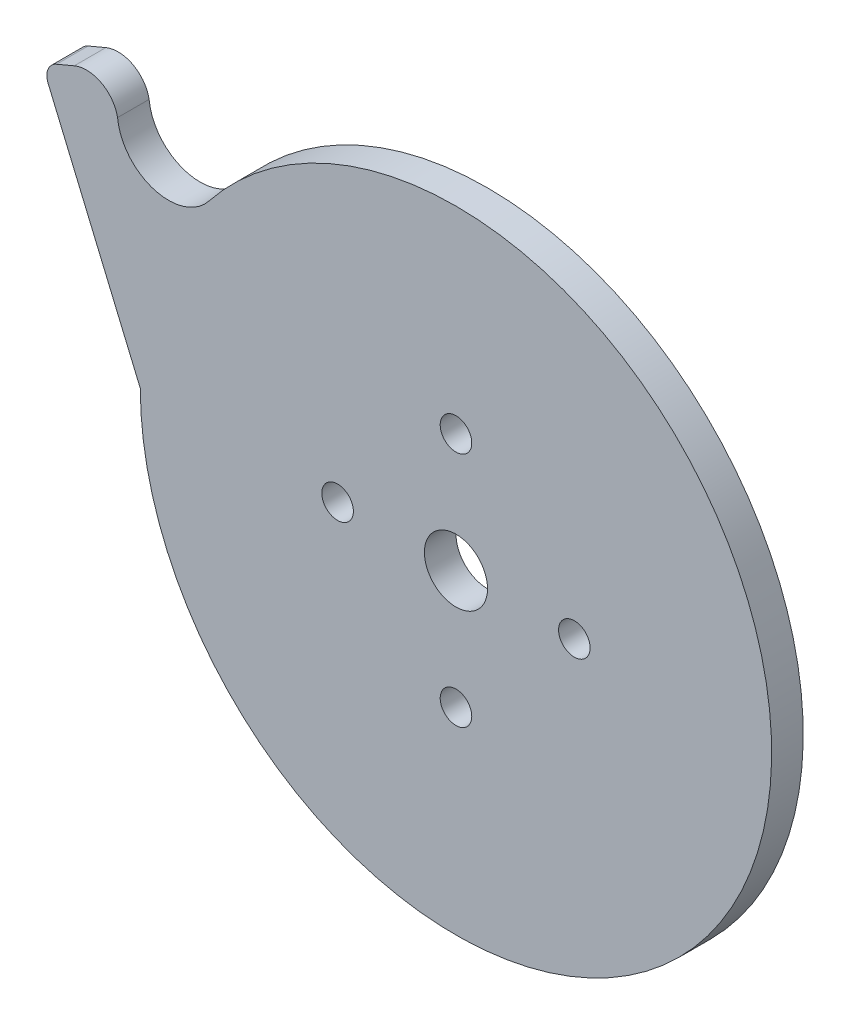
ISO-10303-21;
HEADER;
FILE_DESCRIPTION(('STEP AP214'),'2;1');
FILE_NAME('part.step','',(''),(''),'','','');
FILE_SCHEMA(('AUTOMOTIVE_DESIGN { 1 0 10303 214 1 1 1 1 }'));
ENDSEC;
DATA;
#1=APPLICATION_CONTEXT('core data for automotive mechanical design processes');
#2=APPLICATION_PROTOCOL_DEFINITION('international standard','automotive_design',2000,#1);
#3=PRODUCT_CONTEXT('',#1,'mechanical');
#4=PRODUCT('Part','Part','',(#3));
#5=PRODUCT_RELATED_PRODUCT_CATEGORY('part','',(#4));
#6=PRODUCT_DEFINITION_FORMATION('','',#4);
#7=PRODUCT_DEFINITION_CONTEXT('part definition',#1,'design');
#8=PRODUCT_DEFINITION('design','',#6,#7);
#9=PRODUCT_DEFINITION_SHAPE('','',#8);
#10=(LENGTH_UNIT() NAMED_UNIT(*) SI_UNIT(.MILLI.,.METRE.));
#11=(NAMED_UNIT(*) PLANE_ANGLE_UNIT() SI_UNIT($,.RADIAN.));
#12=(NAMED_UNIT(*) SI_UNIT($,.STERADIAN.) SOLID_ANGLE_UNIT());
#13=UNCERTAINTY_MEASURE_WITH_UNIT(LENGTH_MEASURE(1.E-05),#10,'distance_accuracy_value','');
#14=(GEOMETRIC_REPRESENTATION_CONTEXT(3) GLOBAL_UNCERTAINTY_ASSIGNED_CONTEXT((#13)) GLOBAL_UNIT_ASSIGNED_CONTEXT((#10,
#11,#12)) REPRESENTATION_CONTEXT('',''));
#15=CARTESIAN_POINT('',(0.,0.,0.));
#16=DIRECTION('',(0.,0.,1.));
#17=DIRECTION('',(1.,0.,0.));
#18=AXIS2_PLACEMENT_3D('',#15,#16,#17);
#19=CARTESIAN_POINT('',(0.,0.,4.));
#20=DIRECTION('',(0.,0.,1.));
#21=DIRECTION('',(1.,0.,0.));
#22=AXIS2_PLACEMENT_3D('',#19,#20,#21);
#23=PLANE('',#22);
#24=CARTESIAN_POINT('',(8.47140372315957E-13,-15.,4.));
#25=DIRECTION('',(0.,0.,1.));
#26=DIRECTION('',(1.,0.,0.));
#27=AXIS2_PLACEMENT_3D('',#24,#25,#26);
#28=CIRCLE('',#27,2.00000000000091);
#29=CARTESIAN_POINT('',(2.00000000000176,-15.,4.));
#30=VERTEX_POINT('',#29);
#31=EDGE_CURVE('E200',#30,#30,#28,.T.);
#32=ORIENTED_EDGE('',*,*,#31,.F.);
#33=EDGE_LOOP('',(#32));
#34=FACE_BOUND('',#33,.T.);
#35=CARTESIAN_POINT('',(0.,15.,4.));
#36=DIRECTION('',(0.,0.,1.));
#37=DIRECTION('',(1.,0.,0.));
#38=AXIS2_PLACEMENT_3D('',#35,#36,#37);
#39=CIRCLE('',#38,2.);
#40=CARTESIAN_POINT('',(2.,15.,4.));
#41=VERTEX_POINT('',#40);
#42=EDGE_CURVE('E212',#41,#41,#39,.T.);
#43=ORIENTED_EDGE('',*,*,#42,.F.);
#44=EDGE_LOOP('',(#43));
#45=FACE_BOUND('',#44,.T.);
#46=CARTESIAN_POINT('',(0.,0.,4.));
#47=DIRECTION('',(0.,0.,1.));
#48=DIRECTION('',(1.,0.,0.));
#49=AXIS2_PLACEMENT_3D('',#46,#47,#48);
#50=CIRCLE('',#49,40.);
#51=CARTESIAN_POINT('',(-40.,0.,4.));
#52=VERTEX_POINT('',#51);
#53=CARTESIAN_POINT('',(-31.3230617618042,24.8770135238577,4.));
#54=VERTEX_POINT('',#53);
#55=EDGE_CURVE('E136',#52,#54,#50,.T.);
#56=ORIENTED_EDGE('',*,*,#55,.T.);
#57=CARTESIAN_POINT('',(-36.4130592980974,28.9195282214846,4.));
#58=DIRECTION('',(0.,0.,-1.));
#59=DIRECTION('',(1.,0.,0.));
#60=AXIS2_PLACEMENT_3D('',#57,#58,#59);
#61=CIRCLE('',#60,6.5);
#62=CARTESIAN_POINT('',(-42.8802251890136,28.2670212564872,4.));
#63=VERTEX_POINT('',#62);
#64=EDGE_CURVE('E94',#54,#63,#61,.T.);
#65=ORIENTED_EDGE('',*,*,#64,.T.);
#66=CARTESIAN_POINT('',(-46.8099094698054,27.5203074871636,4.));
#67=DIRECTION('',(0.,0.,1.));
#68=DIRECTION('',(-1.,0.,0.));
#69=AXIS2_PLACEMENT_3D('',#66,#67,#68);
#70=CIRCLE('',#69,4.);
#71=CARTESIAN_POINT('',(-48.3674049433745,31.2046266711937,4.));
#72=VERTEX_POINT('',#71);
#73=EDGE_CURVE('E107',#63,#72,#70,.T.);
#74=ORIENTED_EDGE('',*,*,#73,.T.);
#75=DIRECTION('',(-0.921079796007518,-0.389373868392256,0.));
#76=VECTOR('',#75,1.);
#77=CARTESIAN_POINT('',(-50.6178041965371,30.2533012090251,4.));
#78=LINE('',#77,#76);
#79=CARTESIAN_POINT('',(-50.6178041965371,30.2533012090251,4.));
#80=VERTEX_POINT('',#79);
#81=EDGE_CURVE('E101',#72,#80,#78,.T.);
#82=ORIENTED_EDGE('',*,*,#81,.T.);
#83=CARTESIAN_POINT('',(-49.8390564597526,28.41114161701,4.));
#84=DIRECTION('',(0.,0.,1.));
#85=DIRECTION('',(-1.,0.,0.));
#86=AXIS2_PLACEMENT_3D('',#83,#84,#85);
#87=CIRCLE('',#86,2.);
#88=CARTESIAN_POINT('',(-51.6812160517676,27.6323938802255,4.));
#89=VERTEX_POINT('',#88);
#90=EDGE_CURVE('E105',#80,#89,#87,.T.);
#91=ORIENTED_EDGE('',*,*,#90,.T.);
#92=DIRECTION('',(0.389373868392255,-0.921079796007518,0.));
#93=VECTOR('',#92,1.);
#94=CARTESIAN_POINT('',(-40.,0.,4.));
#95=LINE('',#94,#93);
#96=EDGE_CURVE('E57',#89,#52,#95,.T.);
#97=ORIENTED_EDGE('',*,*,#96,.T.);
#98=EDGE_LOOP('',(#56,#65,#74,#82,#91,#97));
#99=FACE_BOUND('',#98,.T.);
#100=CARTESIAN_POINT('',(0.,0.,4.));
#101=DIRECTION('',(0.,0.,1.));
#102=DIRECTION('',(1.,0.,0.));
#103=AXIS2_PLACEMENT_3D('',#100,#101,#102);
#104=CIRCLE('',#103,4.);
#105=CARTESIAN_POINT('',(4.,0.,4.));
#106=VERTEX_POINT('',#105);
#107=EDGE_CURVE('E129',#106,#106,#104,.T.);
#108=ORIENTED_EDGE('',*,*,#107,.F.);
#109=EDGE_LOOP('',(#108));
#110=FACE_BOUND('',#109,.T.);
#111=CARTESIAN_POINT('',(15.,0.,4.));
#112=DIRECTION('',(0.,0.,1.));
#113=DIRECTION('',(1.,0.,0.));
#114=AXIS2_PLACEMENT_3D('',#111,#112,#113);
#115=CIRCLE('',#114,2.);
#116=CARTESIAN_POINT('',(17.,0.,4.));
#117=VERTEX_POINT('',#116);
#118=EDGE_CURVE('E206',#117,#117,#115,.T.);
#119=ORIENTED_EDGE('',*,*,#118,.F.);
#120=EDGE_LOOP('',(#119));
#121=FACE_BOUND('',#120,.T.);
#122=CARTESIAN_POINT('',(-15.,1.57116660247941E-13,4.));
#123=DIRECTION('',(0.,0.,1.));
#124=DIRECTION('',(1.,0.,0.));
#125=AXIS2_PLACEMENT_3D('',#122,#123,#124);
#126=CIRCLE('',#125,2.);
#127=CARTESIAN_POINT('',(-13.,1.57116660247941E-13,4.));
#128=VERTEX_POINT('',#127);
#129=EDGE_CURVE('E191',#128,#128,#126,.T.);
#130=ORIENTED_EDGE('',*,*,#129,.F.);
#131=EDGE_LOOP('',(#130));
#132=FACE_BOUND('',#131,.T.);
#133=ADVANCED_FACE('F40',(#34,#45,#99,#110,#121,#132),#23,.T.);
#134=CARTESIAN_POINT('',(0.,0.,0.));
#135=DIRECTION('',(0.,0.,1.));
#136=DIRECTION('',(1.,0.,0.));
#137=AXIS2_PLACEMENT_3D('',#134,#135,#136);
#138=PLANE('',#137);
#139=CARTESIAN_POINT('',(0.,0.,0.));
#140=DIRECTION('',(0.,0.,1.));
#141=DIRECTION('',(1.,0.,0.));
#142=AXIS2_PLACEMENT_3D('',#139,#140,#141);
#143=CIRCLE('',#142,40.);
#144=CARTESIAN_POINT('',(-40.,0.,0.));
#145=VERTEX_POINT('',#144);
#146=CARTESIAN_POINT('',(-31.3230617618042,24.8770135238577,0.));
#147=VERTEX_POINT('',#146);
#148=EDGE_CURVE('E125',#145,#147,#143,.T.);
#149=ORIENTED_EDGE('',*,*,#148,.F.);
#150=DIRECTION('',(0.389373868392255,-0.921079796007518,0.));
#151=VECTOR('',#150,1.);
#152=CARTESIAN_POINT('',(-40.,0.,0.));
#153=LINE('',#152,#151);
#154=CARTESIAN_POINT('',(-51.6812160517676,27.6323938802255,0.));
#155=VERTEX_POINT('',#154);
#156=EDGE_CURVE('E86',#155,#145,#153,.T.);
#157=ORIENTED_EDGE('',*,*,#156,.F.);
#158=CARTESIAN_POINT('',(-49.8390564597526,28.41114161701,0.));
#159=DIRECTION('',(0.,0.,1.));
#160=DIRECTION('',(-1.,0.,0.));
#161=AXIS2_PLACEMENT_3D('',#158,#159,#160);
#162=CIRCLE('',#161,2.);
#163=CARTESIAN_POINT('',(-50.6178041965371,30.2533012090251,0.));
#164=VERTEX_POINT('',#163);
#165=EDGE_CURVE('E80',#164,#155,#162,.T.);
#166=ORIENTED_EDGE('',*,*,#165,.F.);
#167=DIRECTION('',(-0.921079796007518,-0.389373868392256,0.));
#168=VECTOR('',#167,1.);
#169=CARTESIAN_POINT('',(-50.6178041965371,30.2533012090251,0.));
#170=LINE('',#169,#168);
#171=CARTESIAN_POINT('',(-48.3674049433745,31.2046266711937,0.));
#172=VERTEX_POINT('',#171);
#173=EDGE_CURVE('E115',#172,#164,#170,.T.);
#174=ORIENTED_EDGE('',*,*,#173,.F.);
#175=CARTESIAN_POINT('',(-46.8099094698054,27.5203074871636,0.));
#176=DIRECTION('',(0.,0.,1.));
#177=DIRECTION('',(-1.,0.,0.));
#178=AXIS2_PLACEMENT_3D('',#175,#176,#177);
#179=CIRCLE('',#178,4.);
#180=CARTESIAN_POINT('',(-42.8802251890136,28.2670212564872,0.));
#181=VERTEX_POINT('',#180);
#182=EDGE_CURVE('E131',#181,#172,#179,.T.);
#183=ORIENTED_EDGE('',*,*,#182,.F.);
#184=CARTESIAN_POINT('',(-36.4130592980974,28.9195282214846,0.));
#185=DIRECTION('',(0.,0.,-1.));
#186=DIRECTION('',(1.,0.,0.));
#187=AXIS2_PLACEMENT_3D('',#184,#185,#186);
#188=CIRCLE('',#187,6.5);
#189=EDGE_CURVE('E128',#147,#181,#188,.T.);
#190=ORIENTED_EDGE('',*,*,#189,.F.);
#191=EDGE_LOOP('',(#149,#157,#166,#174,#183,#190));
#192=FACE_BOUND('',#191,.T.);
#193=CARTESIAN_POINT('',(0.,0.,0.));
#194=DIRECTION('',(0.,0.,1.));
#195=DIRECTION('',(1.,0.,0.));
#196=AXIS2_PLACEMENT_3D('',#193,#194,#195);
#197=CIRCLE('',#196,4.);
#198=CARTESIAN_POINT('',(4.,0.,0.));
#199=VERTEX_POINT('',#198);
#200=EDGE_CURVE('E215',#199,#199,#197,.T.);
#201=ORIENTED_EDGE('',*,*,#200,.T.);
#202=EDGE_LOOP('',(#201));
#203=FACE_BOUND('',#202,.T.);
#204=CARTESIAN_POINT('',(0.,15.,0.));
#205=DIRECTION('',(0.,0.,1.));
#206=DIRECTION('',(1.,0.,0.));
#207=AXIS2_PLACEMENT_3D('',#204,#205,#206);
#208=CIRCLE('',#207,2.);
#209=CARTESIAN_POINT('',(2.,15.,0.));
#210=VERTEX_POINT('',#209);
#211=EDGE_CURVE('E209',#210,#210,#208,.T.);
#212=ORIENTED_EDGE('',*,*,#211,.T.);
#213=EDGE_LOOP('',(#212));
#214=FACE_BOUND('',#213,.T.);
#215=CARTESIAN_POINT('',(15.,0.,0.));
#216=DIRECTION('',(0.,0.,1.));
#217=DIRECTION('',(1.,0.,0.));
#218=AXIS2_PLACEMENT_3D('',#215,#216,#217);
#219=CIRCLE('',#218,2.);
#220=CARTESIAN_POINT('',(17.,0.,0.));
#221=VERTEX_POINT('',#220);
#222=EDGE_CURVE('E203',#221,#221,#219,.T.);
#223=ORIENTED_EDGE('',*,*,#222,.T.);
#224=EDGE_LOOP('',(#223));
#225=FACE_BOUND('',#224,.T.);
#226=CARTESIAN_POINT('',(8.47140372315957E-13,-15.,0.));
#227=DIRECTION('',(0.,0.,1.));
#228=DIRECTION('',(1.,0.,0.));
#229=AXIS2_PLACEMENT_3D('',#226,#227,#228);
#230=CIRCLE('',#229,2.00000000000091);
#231=CARTESIAN_POINT('',(2.00000000000176,-15.,0.));
#232=VERTEX_POINT('',#231);
#233=EDGE_CURVE('E197',#232,#232,#230,.T.);
#234=ORIENTED_EDGE('',*,*,#233,.T.);
#235=EDGE_LOOP('',(#234));
#236=FACE_BOUND('',#235,.T.);
#237=CARTESIAN_POINT('',(-15.,1.57116660247941E-13,0.));
#238=DIRECTION('',(0.,0.,1.));
#239=DIRECTION('',(1.,0.,0.));
#240=AXIS2_PLACEMENT_3D('',#237,#238,#239);
#241=CIRCLE('',#240,2.);
#242=CARTESIAN_POINT('',(-13.,1.57116660247941E-13,0.));
#243=VERTEX_POINT('',#242);
#244=EDGE_CURVE('E194',#243,#243,#241,.T.);
#245=ORIENTED_EDGE('',*,*,#244,.T.);
#246=EDGE_LOOP('',(#245));
#247=FACE_BOUND('',#246,.T.);
#248=ADVANCED_FACE('F145',(#192,#203,#214,#225,#236,#247),#138,.F.);
#249=CARTESIAN_POINT('',(0.,0.,4.));
#250=DIRECTION('',(0.,0.,-1.));
#251=DIRECTION('',(-1.,0.,0.));
#252=AXIS2_PLACEMENT_3D('',#249,#250,#251);
#253=CYLINDRICAL_SURFACE('',#252,40.);
#254=ORIENTED_EDGE('',*,*,#148,.T.);
#255=DIRECTION('',(0.,0.,-1.));
#256=VECTOR('',#255,1.);
#257=CARTESIAN_POINT('',(-31.3230617618042,24.8770135238577,4.));
#258=LINE('',#257,#256);
#259=EDGE_CURVE('E11',#54,#147,#258,.T.);
#260=ORIENTED_EDGE('',*,*,#259,.F.);
#261=ORIENTED_EDGE('',*,*,#55,.F.);
#262=DIRECTION('',(0.,0.,-1.));
#263=VECTOR('',#262,1.);
#264=CARTESIAN_POINT('',(-40.,0.,4.));
#265=LINE('',#264,#263);
#266=EDGE_CURVE('E121',#52,#145,#265,.T.);
#267=ORIENTED_EDGE('',*,*,#266,.T.);
#268=EDGE_LOOP('',(#254,#260,#261,#267));
#269=FACE_BOUND('',#268,.T.);
#270=ADVANCED_FACE('F42',(#269),#253,.T.);
#271=CARTESIAN_POINT('',(-36.4130592980974,28.9195282214846,4.));
#272=DIRECTION('',(0.,0.,-1.));
#273=DIRECTION('',(-1.,0.,0.));
#274=AXIS2_PLACEMENT_3D('',#271,#272,#273);
#275=CYLINDRICAL_SURFACE('',#274,6.5);
#276=ORIENTED_EDGE('',*,*,#189,.T.);
#277=DIRECTION('',(0.,0.,-1.));
#278=VECTOR('',#277,1.);
#279=CARTESIAN_POINT('',(-42.8802251890136,28.2670212564872,4.));
#280=LINE('',#279,#278);
#281=EDGE_CURVE('E49',#63,#181,#280,.T.);
#282=ORIENTED_EDGE('',*,*,#281,.F.);
#283=ORIENTED_EDGE('',*,*,#64,.F.);
#284=ORIENTED_EDGE('',*,*,#259,.T.);
#285=EDGE_LOOP('',(#276,#282,#283,#284));
#286=FACE_BOUND('',#285,.T.);
#287=ADVANCED_FACE('F282',(#286),#275,.F.);
#288=CARTESIAN_POINT('',(-46.8099094698054,27.5203074871636,4.));
#289=DIRECTION('',(0.,0.,-1.));
#290=DIRECTION('',(-1.,0.,0.));
#291=AXIS2_PLACEMENT_3D('',#288,#289,#290);
#292=CYLINDRICAL_SURFACE('',#291,4.);
#293=ORIENTED_EDGE('',*,*,#182,.T.);
#294=DIRECTION('',(0.,0.,-1.));
#295=VECTOR('',#294,1.);
#296=CARTESIAN_POINT('',(-48.3674049433745,31.2046266711937,4.));
#297=LINE('',#296,#295);
#298=EDGE_CURVE('E116',#72,#172,#297,.T.);
#299=ORIENTED_EDGE('',*,*,#298,.F.);
#300=ORIENTED_EDGE('',*,*,#73,.F.);
#301=ORIENTED_EDGE('',*,*,#281,.T.);
#302=EDGE_LOOP('',(#293,#299,#300,#301));
#303=FACE_BOUND('',#302,.T.);
#304=ADVANCED_FACE('F142',(#303),#292,.T.);
#305=CARTESIAN_POINT('',(-50.6178041965371,30.2533012090251,4.));
#306=DIRECTION('',(0.389373868392256,-0.921079796007518,0.));
#307=DIRECTION('',(0.921079796007518,0.389373868392256,0.));
#308=AXIS2_PLACEMENT_3D('',#305,#306,#307);
#309=PLANE('',#308);
#310=ORIENTED_EDGE('',*,*,#173,.T.);
#311=DIRECTION('',(0.,0.,-1.));
#312=VECTOR('',#311,1.);
#313=CARTESIAN_POINT('',(-50.6178041965371,30.2533012090251,4.));
#314=LINE('',#313,#312);
#315=EDGE_CURVE('E112',#80,#164,#314,.T.);
#316=ORIENTED_EDGE('',*,*,#315,.F.);
#317=ORIENTED_EDGE('',*,*,#81,.F.);
#318=ORIENTED_EDGE('',*,*,#298,.T.);
#319=EDGE_LOOP('',(#310,#316,#317,#318));
#320=FACE_BOUND('',#319,.T.);
#321=ADVANCED_FACE('F113',(#320),#309,.F.);
#322=CARTESIAN_POINT('',(-49.8390564597526,28.41114161701,4.));
#323=DIRECTION('',(0.,0.,-1.));
#324=DIRECTION('',(-1.,0.,0.));
#325=AXIS2_PLACEMENT_3D('',#322,#323,#324);
#326=CYLINDRICAL_SURFACE('',#325,2.);
#327=ORIENTED_EDGE('',*,*,#165,.T.);
#328=DIRECTION('',(0.,0.,-1.));
#329=VECTOR('',#328,1.);
#330=CARTESIAN_POINT('',(-51.6812160517676,27.6323938802255,4.));
#331=LINE('',#330,#329);
#332=EDGE_CURVE('E117',#89,#155,#331,.T.);
#333=ORIENTED_EDGE('',*,*,#332,.F.);
#334=ORIENTED_EDGE('',*,*,#90,.F.);
#335=ORIENTED_EDGE('',*,*,#315,.T.);
#336=EDGE_LOOP('',(#327,#333,#334,#335));
#337=FACE_BOUND('',#336,.T.);
#338=ADVANCED_FACE('F119',(#337),#326,.T.);
#339=CARTESIAN_POINT('',(-40.,0.,4.));
#340=DIRECTION('',(0.921079796007518,0.389373868392255,0.));
#341=DIRECTION('',(-0.389373868392255,0.921079796007518,0.));
#342=AXIS2_PLACEMENT_3D('',#339,#340,#341);
#343=PLANE('',#342);
#344=ORIENTED_EDGE('',*,*,#156,.T.);
#345=ORIENTED_EDGE('',*,*,#266,.F.);
#346=ORIENTED_EDGE('',*,*,#96,.F.);
#347=ORIENTED_EDGE('',*,*,#332,.T.);
#348=EDGE_LOOP('',(#344,#345,#346,#347));
#349=FACE_BOUND('',#348,.T.);
#350=ADVANCED_FACE('F150',(#349),#343,.F.);
#351=CARTESIAN_POINT('',(0.,0.,4.));
#352=DIRECTION('',(0.,0.,-1.));
#353=DIRECTION('',(-1.,0.,0.));
#354=AXIS2_PLACEMENT_3D('',#351,#352,#353);
#355=CYLINDRICAL_SURFACE('',#354,4.);
#356=ORIENTED_EDGE('',*,*,#107,.T.);
#357=EDGE_LOOP('',(#356));
#358=FACE_BOUND('',#357,.T.);
#359=ORIENTED_EDGE('',*,*,#200,.F.);
#360=EDGE_LOOP('',(#359));
#361=FACE_BOUND('',#360,.T.);
#362=ADVANCED_FACE('F152',(#358,#361),#355,.F.);
#363=CARTESIAN_POINT('',(0.,15.,4.));
#364=DIRECTION('',(0.,0.,-1.));
#365=DIRECTION('',(-1.,0.,0.));
#366=AXIS2_PLACEMENT_3D('',#363,#364,#365);
#367=CYLINDRICAL_SURFACE('',#366,2.);
#368=ORIENTED_EDGE('',*,*,#42,.T.);
#369=EDGE_LOOP('',(#368));
#370=FACE_BOUND('',#369,.T.);
#371=ORIENTED_EDGE('',*,*,#211,.F.);
#372=EDGE_LOOP('',(#371));
#373=FACE_BOUND('',#372,.T.);
#374=ADVANCED_FACE('F158',(#370,#373),#367,.F.);
#375=CARTESIAN_POINT('',(15.,0.,4.));
#376=DIRECTION('',(0.,0.,-1.));
#377=DIRECTION('',(-1.,0.,0.));
#378=AXIS2_PLACEMENT_3D('',#375,#376,#377);
#379=CYLINDRICAL_SURFACE('',#378,2.);
#380=ORIENTED_EDGE('',*,*,#118,.T.);
#381=EDGE_LOOP('',(#380));
#382=FACE_BOUND('',#381,.T.);
#383=ORIENTED_EDGE('',*,*,#222,.F.);
#384=EDGE_LOOP('',(#383));
#385=FACE_BOUND('',#384,.T.);
#386=ADVANCED_FACE('F174',(#382,#385),#379,.F.);
#387=CARTESIAN_POINT('',(8.47140372315957E-13,-15.,4.));
#388=DIRECTION('',(0.,0.,-1.));
#389=DIRECTION('',(-1.,0.,0.));
#390=AXIS2_PLACEMENT_3D('',#387,#388,#389);
#391=CYLINDRICAL_SURFACE('',#390,2.00000000000091);
#392=ORIENTED_EDGE('',*,*,#31,.T.);
#393=EDGE_LOOP('',(#392));
#394=FACE_BOUND('',#393,.T.);
#395=ORIENTED_EDGE('',*,*,#233,.F.);
#396=EDGE_LOOP('',(#395));
#397=FACE_BOUND('',#396,.T.);
#398=ADVANCED_FACE('F178',(#394,#397),#391,.F.);
#399=CARTESIAN_POINT('',(-15.,1.57116660247941E-13,4.));
#400=DIRECTION('',(0.,0.,-1.));
#401=DIRECTION('',(-1.,0.,0.));
#402=AXIS2_PLACEMENT_3D('',#399,#400,#401);
#403=CYLINDRICAL_SURFACE('',#402,2.);
#404=ORIENTED_EDGE('',*,*,#129,.T.);
#405=EDGE_LOOP('',(#404));
#406=FACE_BOUND('',#405,.T.);
#407=ORIENTED_EDGE('',*,*,#244,.F.);
#408=EDGE_LOOP('',(#407));
#409=FACE_BOUND('',#408,.T.);
#410=ADVANCED_FACE('F182',(#406,#409),#403,.F.);
#411=CLOSED_SHELL('',(#133,#248,#270,#287,#304,#321,#338,#350,#362,#374,#386,#398,#410));
#412=MANIFOLD_SOLID_BREP('B2',#411);
#413=ADVANCED_BREP_SHAPE_REPRESENTATION('',(#18,#412),#14);
#414=SHAPE_DEFINITION_REPRESENTATION(#9,#413);
ENDSEC;
END-ISO-10303-21;
